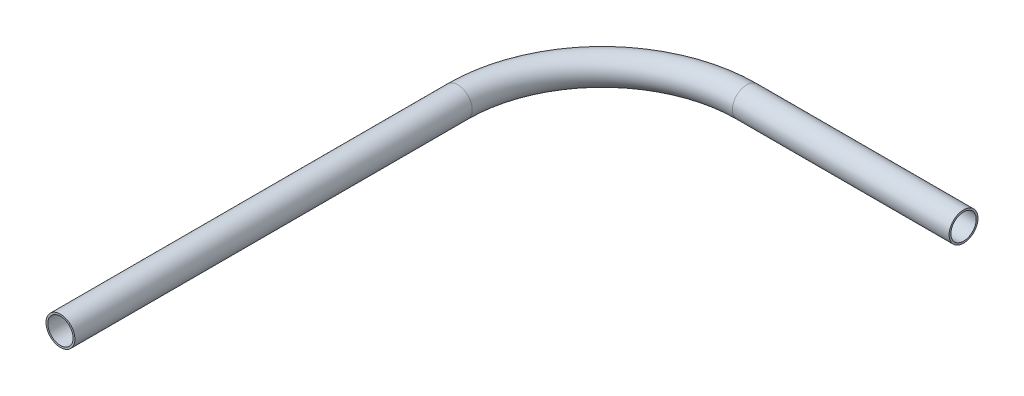
ISO-10303-21;
HEADER;
FILE_DESCRIPTION(('STEP AP214'),'2;1');
FILE_NAME('part.step','',(''),(''),'','','');
FILE_SCHEMA(('AUTOMOTIVE_DESIGN { 1 0 10303 214 1 1 1 1 }'));
ENDSEC;
DATA;
#1=APPLICATION_CONTEXT('core data for automotive mechanical design processes');
#2=APPLICATION_PROTOCOL_DEFINITION('international standard','automotive_design',2000,#1);
#3=PRODUCT_CONTEXT('',#1,'mechanical');
#4=PRODUCT('Part','Part','',(#3));
#5=PRODUCT_RELATED_PRODUCT_CATEGORY('part','',(#4));
#6=PRODUCT_DEFINITION_FORMATION('','',#4);
#7=PRODUCT_DEFINITION_CONTEXT('part definition',#1,'design');
#8=PRODUCT_DEFINITION('design','',#6,#7);
#9=PRODUCT_DEFINITION_SHAPE('','',#8);
#10=(LENGTH_UNIT() NAMED_UNIT(*) SI_UNIT(.MILLI.,.METRE.));
#11=(NAMED_UNIT(*) PLANE_ANGLE_UNIT() SI_UNIT($,.RADIAN.));
#12=(NAMED_UNIT(*) SI_UNIT($,.STERADIAN.) SOLID_ANGLE_UNIT());
#13=UNCERTAINTY_MEASURE_WITH_UNIT(LENGTH_MEASURE(1.E-05),#10,'distance_accuracy_value','');
#14=(GEOMETRIC_REPRESENTATION_CONTEXT(3) GLOBAL_UNCERTAINTY_ASSIGNED_CONTEXT((#13)) GLOBAL_UNIT_ASSIGNED_CONTEXT((#10,
#11,#12)) REPRESENTATION_CONTEXT('',''));
#15=CARTESIAN_POINT('',(0.,0.,0.));
#16=DIRECTION('',(0.,0.,1.));
#17=DIRECTION('',(1.,0.,0.));
#18=AXIS2_PLACEMENT_3D('',#15,#16,#17);
#19=CARTESIAN_POINT('',(0.,0.,0.));
#20=DIRECTION('',(-1.,0.,0.));
#21=DIRECTION('',(0.,0.,1.));
#22=AXIS2_PLACEMENT_3D('',#19,#20,#21);
#23=CYLINDRICAL_SURFACE('',#22,8.);
#24=CARTESIAN_POINT('',(-120.,0.,0.));
#25=DIRECTION('',(1.,0.,0.));
#26=DIRECTION('',(0.,0.,-1.));
#27=AXIS2_PLACEMENT_3D('',#24,#25,#26);
#28=CIRCLE('',#27,8.);
#29=CARTESIAN_POINT('',(-120.,0.,-7.99999999999998));
#30=VERTEX_POINT('',#29);
#31=EDGE_CURVE('E64',#30,#30,#28,.T.);
#32=ORIENTED_EDGE('',*,*,#31,.T.);
#33=EDGE_LOOP('',(#32));
#34=FACE_BOUND('',#33,.T.);
#35=CARTESIAN_POINT('',(0.,0.,0.));
#36=DIRECTION('',(1.,0.,0.));
#37=DIRECTION('',(0.,0.,-1.));
#38=AXIS2_PLACEMENT_3D('',#35,#36,#37);
#39=CIRCLE('',#38,8.);
#40=CARTESIAN_POINT('',(0.,0.,-8.));
#41=VERTEX_POINT('',#40);
#42=EDGE_CURVE('E61',#41,#41,#39,.T.);
#43=ORIENTED_EDGE('',*,*,#42,.F.);
#44=EDGE_LOOP('',(#43));
#45=FACE_BOUND('',#44,.T.);
#46=ADVANCED_FACE('F37',(#34,#45),#23,.T.);
#47=CARTESIAN_POINT('',(-120.,0.,80.));
#48=DIRECTION('',(0.,1.,0.));
#49=DIRECTION('',(0.,0.,1.));
#50=AXIS2_PLACEMENT_3D('',#47,#48,#49);
#51=TOROIDAL_SURFACE('',#50,80.,8.);
#52=CARTESIAN_POINT('',(-200.,0.,80.));
#53=DIRECTION('',(0.,0.,-1.));
#54=DIRECTION('',(-1.,0.,0.));
#55=AXIS2_PLACEMENT_3D('',#52,#53,#54);
#56=CIRCLE('',#55,8.);
#57=CARTESIAN_POINT('',(-208.,0.,80.));
#58=VERTEX_POINT('',#57);
#59=EDGE_CURVE('E41',#58,#58,#56,.T.);
#60=CARTESIAN_POINT('',(-120.,0.,80.));
#61=DIRECTION('',(0.,1.,0.));
#62=DIRECTION('',(0.,0.,1.));
#63=AXIS2_PLACEMENT_3D('',#60,#61,#62);
#64=CIRCLE('',#63,88.);
#65=EDGE_CURVE('',#30,#58,#64,.T.);
#66=ORIENTED_EDGE('',*,*,#31,.F.);
#67=ORIENTED_EDGE('',*,*,#59,.T.);
#68=ORIENTED_EDGE('',*,*,#65,.T.);
#69=ORIENTED_EDGE('',*,*,#65,.F.);
#70=EDGE_LOOP('',(#66,#68,#67,#69));
#71=FACE_BOUND('',#70,.T.);
#72=ADVANCED_FACE('F73',(#71),#51,.T.);
#73=CARTESIAN_POINT('',(-200.,0.,80.));
#74=DIRECTION('',(0.,0.,1.));
#75=DIRECTION('',(1.,0.,0.));
#76=AXIS2_PLACEMENT_3D('',#73,#74,#75);
#77=CYLINDRICAL_SURFACE('',#76,8.);
#78=CARTESIAN_POINT('',(-200.,0.,300.));
#79=DIRECTION('',(0.,0.,-1.));
#80=DIRECTION('',(-1.,0.,0.));
#81=AXIS2_PLACEMENT_3D('',#78,#79,#80);
#82=CIRCLE('',#81,8.);
#83=CARTESIAN_POINT('',(-208.,0.,300.));
#84=VERTEX_POINT('',#83);
#85=EDGE_CURVE('E56',#84,#84,#82,.T.);
#86=ORIENTED_EDGE('',*,*,#85,.T.);
#87=EDGE_LOOP('',(#86));
#88=FACE_BOUND('',#87,.T.);
#89=ORIENTED_EDGE('',*,*,#59,.F.);
#90=EDGE_LOOP('',(#89));
#91=FACE_BOUND('',#90,.T.);
#92=ADVANCED_FACE('F39',(#88,#91),#77,.T.);
#93=CARTESIAN_POINT('',(0.,0.,0.));
#94=DIRECTION('',(1.,0.,0.));
#95=DIRECTION('',(0.,0.,-1.));
#96=AXIS2_PLACEMENT_3D('',#93,#94,#95);
#97=PLANE('',#96);
#98=CARTESIAN_POINT('',(0.,0.,0.));
#99=DIRECTION('',(1.,0.,0.));
#100=DIRECTION('',(0.,0.,-1.));
#101=AXIS2_PLACEMENT_3D('',#98,#99,#100);
#102=CIRCLE('',#101,7.);
#103=CARTESIAN_POINT('',(0.,0.,-7.));
#104=VERTEX_POINT('',#103);
#105=EDGE_CURVE('E60',#104,#104,#102,.F.);
#106=ORIENTED_EDGE('',*,*,#105,.T.);
#107=EDGE_LOOP('',(#106));
#108=FACE_BOUND('',#107,.T.);
#109=ORIENTED_EDGE('',*,*,#42,.T.);
#110=EDGE_LOOP('',(#109));
#111=FACE_BOUND('',#110,.T.);
#112=ADVANCED_FACE('F77',(#108,#111),#97,.T.);
#113=CARTESIAN_POINT('',(-200.,0.,300.));
#114=DIRECTION('',(0.,0.,-1.));
#115=DIRECTION('',(-1.,0.,0.));
#116=AXIS2_PLACEMENT_3D('',#113,#114,#115);
#117=PLANE('',#116);
#118=CARTESIAN_POINT('',(-200.,0.,300.));
#119=DIRECTION('',(0.,0.,-1.));
#120=DIRECTION('',(-1.,0.,0.));
#121=AXIS2_PLACEMENT_3D('',#118,#119,#120);
#122=CIRCLE('',#121,7.);
#123=CARTESIAN_POINT('',(-207.,0.,300.));
#124=VERTEX_POINT('',#123);
#125=EDGE_CURVE('E10',#124,#124,#122,.F.);
#126=ORIENTED_EDGE('',*,*,#125,.F.);
#127=EDGE_LOOP('',(#126));
#128=FACE_BOUND('',#127,.T.);
#129=ORIENTED_EDGE('',*,*,#85,.F.);
#130=EDGE_LOOP('',(#129));
#131=FACE_BOUND('',#130,.T.);
#132=ADVANCED_FACE('F83',(#128,#131),#117,.F.);
#133=CARTESIAN_POINT('',(0.,0.,0.));
#134=DIRECTION('',(-1.,0.,0.));
#135=DIRECTION('',(0.,0.,1.));
#136=AXIS2_PLACEMENT_3D('',#133,#134,#135);
#137=CYLINDRICAL_SURFACE('',#136,7.);
#138=CARTESIAN_POINT('',(-120.,0.,0.));
#139=DIRECTION('',(1.,0.,0.));
#140=DIRECTION('',(0.,0.,-1.));
#141=AXIS2_PLACEMENT_3D('',#138,#139,#140);
#142=CIRCLE('',#141,7.);
#143=CARTESIAN_POINT('',(-120.,0.,-6.99999999999999));
#144=VERTEX_POINT('',#143);
#145=EDGE_CURVE('E52',#144,#144,#142,.F.);
#146=ORIENTED_EDGE('',*,*,#145,.T.);
#147=EDGE_LOOP('',(#146));
#148=FACE_BOUND('',#147,.T.);
#149=ORIENTED_EDGE('',*,*,#105,.F.);
#150=EDGE_LOOP('',(#149));
#151=FACE_BOUND('',#150,.T.);
#152=ADVANCED_FACE('F93',(#148,#151),#137,.F.);
#153=CARTESIAN_POINT('',(-120.,0.,80.));
#154=DIRECTION('',(0.,1.,0.));
#155=DIRECTION('',(0.,0.,1.));
#156=AXIS2_PLACEMENT_3D('',#153,#154,#155);
#157=TOROIDAL_SURFACE('',#156,80.,7.);
#158=CARTESIAN_POINT('',(-200.,0.,80.));
#159=DIRECTION('',(0.,0.,-1.));
#160=DIRECTION('',(-1.,0.,0.));
#161=AXIS2_PLACEMENT_3D('',#158,#159,#160);
#162=CIRCLE('',#161,7.);
#163=CARTESIAN_POINT('',(-207.,0.,80.));
#164=VERTEX_POINT('',#163);
#165=EDGE_CURVE('E46',#164,#164,#162,.F.);
#166=CARTESIAN_POINT('',(-120.,0.,80.));
#167=DIRECTION('',(0.,1.,0.));
#168=DIRECTION('',(0.,0.,1.));
#169=AXIS2_PLACEMENT_3D('',#166,#167,#168);
#170=CIRCLE('',#169,87.);
#171=EDGE_CURVE('',#144,#164,#170,.T.);
#172=ORIENTED_EDGE('',*,*,#145,.F.);
#173=ORIENTED_EDGE('',*,*,#165,.T.);
#174=ORIENTED_EDGE('',*,*,#171,.T.);
#175=ORIENTED_EDGE('',*,*,#171,.F.);
#176=EDGE_LOOP('',(#172,#174,#173,#175));
#177=FACE_BOUND('',#176,.T.);
#178=ADVANCED_FACE('F88',(#177),#157,.F.);
#179=CARTESIAN_POINT('',(-200.,0.,80.));
#180=DIRECTION('',(0.,0.,1.));
#181=DIRECTION('',(1.,0.,0.));
#182=AXIS2_PLACEMENT_3D('',#179,#180,#181);
#183=CYLINDRICAL_SURFACE('',#182,7.);
#184=ORIENTED_EDGE('',*,*,#125,.T.);
#185=EDGE_LOOP('',(#184));
#186=FACE_BOUND('',#185,.T.);
#187=ORIENTED_EDGE('',*,*,#165,.F.);
#188=EDGE_LOOP('',(#187));
#189=FACE_BOUND('',#188,.T.);
#190=ADVANCED_FACE('F86',(#186,#189),#183,.F.);
#191=CLOSED_SHELL('',(#46,#72,#92,#112,#132,#152,#178,#190));
#192=MANIFOLD_SOLID_BREP('B2',#191);
#193=ADVANCED_BREP_SHAPE_REPRESENTATION('',(#18,#192),#14);
#194=SHAPE_DEFINITION_REPRESENTATION(#9,#193);
ENDSEC;
END-ISO-10303-21;
